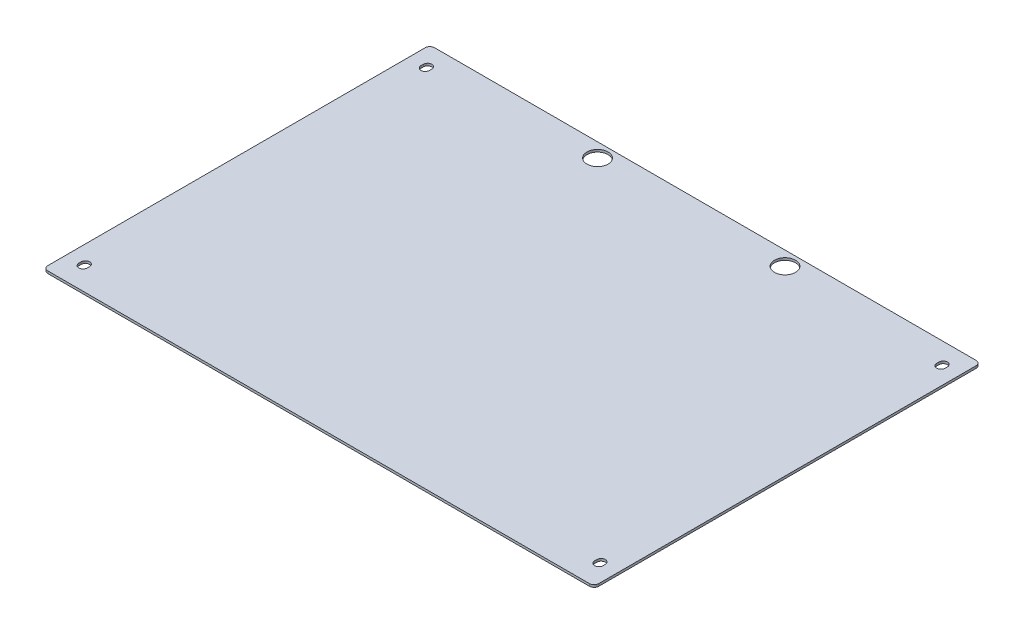
ISO-10303-21;
HEADER;
FILE_DESCRIPTION(('STEP AP214'),'2;1');
FILE_NAME('part.step','',(''),(''),'','','');
FILE_SCHEMA(('AUTOMOTIVE_DESIGN { 1 0 10303 214 1 1 1 1 }'));
ENDSEC;
DATA;
#1=APPLICATION_CONTEXT('core data for automotive mechanical design processes');
#2=APPLICATION_PROTOCOL_DEFINITION('international standard','automotive_design',2000,#1);
#3=PRODUCT_CONTEXT('',#1,'mechanical');
#4=PRODUCT('Part','Part','',(#3));
#5=PRODUCT_RELATED_PRODUCT_CATEGORY('part','',(#4));
#6=PRODUCT_DEFINITION_FORMATION('','',#4);
#7=PRODUCT_DEFINITION_CONTEXT('part definition',#1,'design');
#8=PRODUCT_DEFINITION('design','',#6,#7);
#9=PRODUCT_DEFINITION_SHAPE('','',#8);
#10=(LENGTH_UNIT() NAMED_UNIT(*) SI_UNIT(.MILLI.,.METRE.));
#11=(NAMED_UNIT(*) PLANE_ANGLE_UNIT() SI_UNIT($,.RADIAN.));
#12=(NAMED_UNIT(*) SI_UNIT($,.STERADIAN.) SOLID_ANGLE_UNIT());
#13=UNCERTAINTY_MEASURE_WITH_UNIT(LENGTH_MEASURE(1.E-05),#10,'distance_accuracy_value','');
#14=(GEOMETRIC_REPRESENTATION_CONTEXT(3) GLOBAL_UNCERTAINTY_ASSIGNED_CONTEXT((#13)) GLOBAL_UNIT_ASSIGNED_CONTEXT((#10,
#11,#12)) REPRESENTATION_CONTEXT('',''));
#15=CARTESIAN_POINT('',(0.,0.,0.));
#16=DIRECTION('',(0.,0.,1.));
#17=DIRECTION('',(1.,0.,0.));
#18=AXIS2_PLACEMENT_3D('',#15,#16,#17);
#19=CARTESIAN_POINT('',(0.,-1.,0.));
#20=DIRECTION('',(0.,-1.,0.));
#21=DIRECTION('',(0.,0.,-1.));
#22=AXIS2_PLACEMENT_3D('',#19,#20,#21);
#23=PLANE('',#22);
#24=CARTESIAN_POINT('',(40.0000000000037,-1.,-76.5000000000022));
#25=DIRECTION('',(0.,-1.,0.));
#26=DIRECTION('',(0.,0.,-1.));
#27=AXIS2_PLACEMENT_3D('',#24,#25,#26);
#28=CIRCLE('',#27,4.5);
#29=CARTESIAN_POINT('',(40.0000000000037,-1.,-81.0000000000022));
#30=VERTEX_POINT('',#29);
#31=EDGE_CURVE('E403',#30,#30,#28,.T.);
#32=ORIENTED_EDGE('',*,*,#31,.F.);
#33=EDGE_LOOP('',(#32));
#34=FACE_BOUND('',#33,.T.);
#35=CARTESIAN_POINT('',(-40.0000000000037,-1.,-76.5000000000022));
#36=DIRECTION('',(0.,-1.,0.));
#37=DIRECTION('',(0.,0.,1.));
#38=AXIS2_PLACEMENT_3D('',#35,#36,#37);
#39=CIRCLE('',#38,4.5);
#40=CARTESIAN_POINT('',(-40.0000000000037,-1.,-72.0000000000022));
#41=VERTEX_POINT('',#40);
#42=EDGE_CURVE('E292',#41,#41,#39,.T.);
#43=ORIENTED_EDGE('',*,*,#42,.F.);
#44=EDGE_LOOP('',(#43));
#45=FACE_BOUND('',#44,.T.);
#46=DIRECTION('',(-1.,0.,0.));
#47=VECTOR('',#46,1.);
#48=CARTESIAN_POINT('',(-102.,-1.,-82.5));
#49=LINE('',#48,#47);
#50=CARTESIAN_POINT('',(115.534291735289,-1.0000000000001,-82.5));
#51=VERTEX_POINT('',#50);
#52=CARTESIAN_POINT('',(-115.534291735289,-1.0000000000001,-82.5));
#53=VERTEX_POINT('',#52);
#54=EDGE_CURVE('E97',#51,#53,#49,.T.);
#55=ORIENTED_EDGE('',*,*,#54,.F.);
#56=CARTESIAN_POINT('',(115.534291735289,-1.0000000000001,-80.5));
#57=DIRECTION('',(0.,1.,0.));
#58=DIRECTION('',(-1.,0.,0.));
#59=AXIS2_PLACEMENT_3D('',#56,#57,#58);
#60=CIRCLE('',#59,2.);
#61=CARTESIAN_POINT('',(117.534291735289,-1.0000000000001,-80.5));
#62=VERTEX_POINT('',#61);
#63=EDGE_CURVE('E309',#51,#62,#60,.F.);
#64=ORIENTED_EDGE('',*,*,#63,.T.);
#65=DIRECTION('',(0.,0.,1.));
#66=VECTOR('',#65,1.);
#67=CARTESIAN_POINT('',(117.534291735289,-1.0000000000001,0.));
#68=LINE('',#67,#66);
#69=CARTESIAN_POINT('',(117.534291735289,-1.0000000000001,80.5));
#70=VERTEX_POINT('',#69);
#71=EDGE_CURVE('E306',#62,#70,#68,.T.);
#72=ORIENTED_EDGE('',*,*,#71,.T.);
#73=CARTESIAN_POINT('',(115.534291735289,-1.0000000000001,80.5));
#74=DIRECTION('',(0.,1.,0.));
#75=DIRECTION('',(-1.,0.,0.));
#76=AXIS2_PLACEMENT_3D('',#73,#74,#75);
#77=CIRCLE('',#76,2.);
#78=CARTESIAN_POINT('',(115.534291735289,-1.0000000000001,82.5));
#79=VERTEX_POINT('',#78);
#80=EDGE_CURVE('E302',#70,#79,#77,.F.);
#81=ORIENTED_EDGE('',*,*,#80,.T.);
#82=DIRECTION('',(1.,0.,0.));
#83=VECTOR('',#82,1.);
#84=CARTESIAN_POINT('',(-102.,-1.,82.5));
#85=LINE('',#84,#83);
#86=CARTESIAN_POINT('',(-115.534291735289,-1.0000000000001,82.5));
#87=VERTEX_POINT('',#86);
#88=EDGE_CURVE('E13',#87,#79,#85,.T.);
#89=ORIENTED_EDGE('',*,*,#88,.F.);
#90=CARTESIAN_POINT('',(-115.534291735289,-1.0000000000001,80.5));
#91=DIRECTION('',(0.,1.,0.));
#92=DIRECTION('',(-1.,0.,0.));
#93=AXIS2_PLACEMENT_3D('',#90,#91,#92);
#94=CIRCLE('',#93,2.);
#95=CARTESIAN_POINT('',(-117.534291735289,-1.0000000000001,80.5));
#96=VERTEX_POINT('',#95);
#97=EDGE_CURVE('E471',#87,#96,#94,.F.);
#98=ORIENTED_EDGE('',*,*,#97,.T.);
#99=DIRECTION('',(0.,0.,-1.));
#100=VECTOR('',#99,1.);
#101=CARTESIAN_POINT('',(-117.534291735289,-1.0000000000001,0.));
#102=LINE('',#101,#100);
#103=CARTESIAN_POINT('',(-117.534291735289,-1.0000000000001,-80.5));
#104=VERTEX_POINT('',#103);
#105=EDGE_CURVE('E277',#96,#104,#102,.T.);
#106=ORIENTED_EDGE('',*,*,#105,.T.);
#107=CARTESIAN_POINT('',(-115.534291735289,-1.0000000000001,-80.5));
#108=DIRECTION('',(0.,1.,0.));
#109=DIRECTION('',(-1.,0.,0.));
#110=AXIS2_PLACEMENT_3D('',#107,#108,#109);
#111=CIRCLE('',#110,2.);
#112=EDGE_CURVE('E475',#104,#53,#111,.F.);
#113=ORIENTED_EDGE('',*,*,#112,.T.);
#114=EDGE_LOOP('',(#55,#64,#72,#81,#89,#98,#106,#113));
#115=FACE_BOUND('',#114,.T.);
#116=DIRECTION('',(0.,0.,-1.));
#117=VECTOR('',#116,1.);
#118=CARTESIAN_POINT('',(108.234291735288,-1.00000000000004,73.));
#119=LINE('',#118,#117);
#120=CARTESIAN_POINT('',(108.234291735288,-1.00000000000004,73.));
#121=VERTEX_POINT('',#120);
#122=CARTESIAN_POINT('',(108.234291735288,-1.00000000000004,72.));
#123=VERTEX_POINT('',#122);
#124=EDGE_CURVE('E312',#121,#123,#119,.T.);
#125=ORIENTED_EDGE('',*,*,#124,.F.);
#126=CARTESIAN_POINT('',(110.034291735289,-1.00000000000004,73.));
#127=DIRECTION('',(0.,-1.,0.));
#128=DIRECTION('',(1.,0.,0.));
#129=AXIS2_PLACEMENT_3D('',#126,#127,#128);
#130=CIRCLE('',#129,1.80000000000004);
#131=CARTESIAN_POINT('',(111.834291735289,-1.00000000000007,73.));
#132=VERTEX_POINT('',#131);
#133=EDGE_CURVE('E323',#132,#121,#130,.T.);
#134=ORIENTED_EDGE('',*,*,#133,.F.);
#135=DIRECTION('',(0.,0.,1.));
#136=VECTOR('',#135,1.);
#137=CARTESIAN_POINT('',(111.834291735289,-1.00000000000007,73.));
#138=LINE('',#137,#136);
#139=CARTESIAN_POINT('',(111.834291735289,-1.00000000000007,72.));
#140=VERTEX_POINT('',#139);
#141=EDGE_CURVE('E332',#140,#132,#138,.T.);
#142=ORIENTED_EDGE('',*,*,#141,.F.);
#143=CARTESIAN_POINT('',(110.034291735289,-1.00000000000004,72.));
#144=DIRECTION('',(0.,-1.,0.));
#145=DIRECTION('',(1.,0.,0.));
#146=AXIS2_PLACEMENT_3D('',#143,#144,#145);
#147=CIRCLE('',#146,1.80000000000004);
#148=EDGE_CURVE('E342',#123,#140,#147,.T.);
#149=ORIENTED_EDGE('',*,*,#148,.F.);
#150=EDGE_LOOP('',(#125,#134,#142,#149));
#151=FACE_BOUND('',#150,.T.);
#152=DIRECTION('',(0.,0.,-1.));
#153=VECTOR('',#152,1.);
#154=CARTESIAN_POINT('',(108.234291735288,-1.00000000000004,-73.));
#155=LINE('',#154,#153);
#156=CARTESIAN_POINT('',(108.234291735288,-1.00000000000004,-73.));
#157=VERTEX_POINT('',#156);
#158=CARTESIAN_POINT('',(108.234291735288,-1.00000000000004,-74.));
#159=VERTEX_POINT('',#158);
#160=EDGE_CURVE('E353',#157,#159,#155,.T.);
#161=ORIENTED_EDGE('',*,*,#160,.F.);
#162=CARTESIAN_POINT('',(110.034291735289,-1.00000000000004,-73.));
#163=DIRECTION('',(0.,-1.,0.));
#164=DIRECTION('',(1.,0.,0.));
#165=AXIS2_PLACEMENT_3D('',#162,#163,#164);
#166=CIRCLE('',#165,1.80000000000004);
#167=CARTESIAN_POINT('',(111.834291735289,-1.00000000000007,-73.));
#168=VERTEX_POINT('',#167);
#169=EDGE_CURVE('E364',#168,#157,#166,.T.);
#170=ORIENTED_EDGE('',*,*,#169,.F.);
#171=DIRECTION('',(0.,0.,1.));
#172=VECTOR('',#171,1.);
#173=CARTESIAN_POINT('',(111.834291735289,-1.00000000000007,-73.));
#174=LINE('',#173,#172);
#175=CARTESIAN_POINT('',(111.834291735289,-1.00000000000007,-74.));
#176=VERTEX_POINT('',#175);
#177=EDGE_CURVE('E373',#176,#168,#174,.T.);
#178=ORIENTED_EDGE('',*,*,#177,.F.);
#179=CARTESIAN_POINT('',(110.034291735289,-1.00000000000004,-74.));
#180=DIRECTION('',(0.,-1.,0.));
#181=DIRECTION('',(1.,0.,0.));
#182=AXIS2_PLACEMENT_3D('',#179,#180,#181);
#183=CIRCLE('',#182,1.80000000000002);
#184=EDGE_CURVE('E383',#159,#176,#183,.T.);
#185=ORIENTED_EDGE('',*,*,#184,.F.);
#186=EDGE_LOOP('',(#161,#170,#178,#185));
#187=FACE_BOUND('',#186,.T.);
#188=DIRECTION('',(0.,0.,1.));
#189=VECTOR('',#188,1.);
#190=CARTESIAN_POINT('',(-111.834291735289,-1.0000000000001,73.));
#191=LINE('',#190,#189);
#192=CARTESIAN_POINT('',(-111.834291735289,-1.0000000000001,72.));
#193=VERTEX_POINT('',#192);
#194=CARTESIAN_POINT('',(-111.834291735289,-1.0000000000001,73.));
#195=VERTEX_POINT('',#194);
#196=EDGE_CURVE('E512',#193,#195,#191,.T.);
#197=ORIENTED_EDGE('',*,*,#196,.T.);
#198=CARTESIAN_POINT('',(-110.034291735289,-1.0000000000001,73.));
#199=DIRECTION('',(0.,1.,0.));
#200=DIRECTION('',(-1.,0.,0.));
#201=AXIS2_PLACEMENT_3D('',#198,#199,#200);
#202=CIRCLE('',#201,1.80000000000004);
#203=CARTESIAN_POINT('',(-108.234291735289,-1.0000000000001,73.));
#204=VERTEX_POINT('',#203);
#205=EDGE_CURVE('E508',#195,#204,#202,.T.);
#206=ORIENTED_EDGE('',*,*,#205,.T.);
#207=DIRECTION('',(0.,0.,-1.));
#208=VECTOR('',#207,1.);
#209=CARTESIAN_POINT('',(-108.234291735289,-1.0000000000001,73.));
#210=LINE('',#209,#208);
#211=CARTESIAN_POINT('',(-108.234291735289,-1.00000000000004,72.));
#212=VERTEX_POINT('',#211);
#213=EDGE_CURVE('E504',#204,#212,#210,.T.);
#214=ORIENTED_EDGE('',*,*,#213,.T.);
#215=CARTESIAN_POINT('',(-110.034291735289,-1.0000000000001,72.));
#216=DIRECTION('',(0.,1.,0.));
#217=DIRECTION('',(-1.,0.,0.));
#218=AXIS2_PLACEMENT_3D('',#215,#216,#217);
#219=CIRCLE('',#218,1.80000000000004);
#220=EDGE_CURVE('E500',#212,#193,#219,.T.);
#221=ORIENTED_EDGE('',*,*,#220,.T.);
#222=EDGE_LOOP('',(#197,#206,#214,#221));
#223=FACE_BOUND('',#222,.T.);
#224=DIRECTION('',(0.,0.,1.));
#225=VECTOR('',#224,1.);
#226=CARTESIAN_POINT('',(-111.834291735289,-1.0000000000001,-73.));
#227=LINE('',#226,#225);
#228=CARTESIAN_POINT('',(-111.834291735289,-1.0000000000001,-74.));
#229=VERTEX_POINT('',#228);
#230=CARTESIAN_POINT('',(-111.834291735289,-1.0000000000001,-73.));
#231=VERTEX_POINT('',#230);
#232=EDGE_CURVE('E496',#229,#231,#227,.T.);
#233=ORIENTED_EDGE('',*,*,#232,.T.);
#234=CARTESIAN_POINT('',(-110.034291735289,-1.0000000000001,-73.));
#235=DIRECTION('',(0.,1.,0.));
#236=DIRECTION('',(-1.,0.,0.));
#237=AXIS2_PLACEMENT_3D('',#234,#235,#236);
#238=CIRCLE('',#237,1.80000000000004);
#239=CARTESIAN_POINT('',(-108.234291735289,-1.0000000000001,-73.));
#240=VERTEX_POINT('',#239);
#241=EDGE_CURVE('E492',#231,#240,#238,.T.);
#242=ORIENTED_EDGE('',*,*,#241,.T.);
#243=DIRECTION('',(0.,0.,-1.));
#244=VECTOR('',#243,1.);
#245=CARTESIAN_POINT('',(-108.234291735289,-1.0000000000001,-73.));
#246=LINE('',#245,#244);
#247=CARTESIAN_POINT('',(-108.234291735289,-1.00000000000004,-74.));
#248=VERTEX_POINT('',#247);
#249=EDGE_CURVE('E488',#240,#248,#246,.T.);
#250=ORIENTED_EDGE('',*,*,#249,.T.);
#251=CARTESIAN_POINT('',(-110.034291735289,-1.0000000000001,-74.));
#252=DIRECTION('',(0.,1.,0.));
#253=DIRECTION('',(-1.,0.,0.));
#254=AXIS2_PLACEMENT_3D('',#251,#252,#253);
#255=CIRCLE('',#254,1.80000000000002);
#256=EDGE_CURVE('E484',#248,#229,#255,.T.);
#257=ORIENTED_EDGE('',*,*,#256,.T.);
#258=EDGE_LOOP('',(#233,#242,#250,#257));
#259=FACE_BOUND('',#258,.T.);
#260=ADVANCED_FACE('F86',(#34,#45,#115,#151,#187,#223,#259),#23,.T.);
#261=CARTESIAN_POINT('',(0.,0.,0.));
#262=DIRECTION('',(0.,-1.,0.));
#263=DIRECTION('',(0.,0.,-1.));
#264=AXIS2_PLACEMENT_3D('',#261,#262,#263);
#265=PLANE('',#264);
#266=CARTESIAN_POINT('',(40.0000000000037,0.,-76.5000000000022));
#267=DIRECTION('',(0.,-1.,0.));
#268=DIRECTION('',(0.,0.,-1.));
#269=AXIS2_PLACEMENT_3D('',#266,#267,#268);
#270=CIRCLE('',#269,4.5);
#271=CARTESIAN_POINT('',(40.0000000000037,0.,-81.0000000000022));
#272=VERTEX_POINT('',#271);
#273=EDGE_CURVE('E90',#272,#272,#270,.T.);
#274=ORIENTED_EDGE('',*,*,#273,.T.);
#275=EDGE_LOOP('',(#274));
#276=FACE_BOUND('',#275,.T.);
#277=CARTESIAN_POINT('',(-40.0000000000037,0.,-76.5000000000022));
#278=DIRECTION('',(0.,-1.,0.));
#279=DIRECTION('',(0.,0.,-1.));
#280=AXIS2_PLACEMENT_3D('',#277,#278,#279);
#281=CIRCLE('',#280,4.5);
#282=CARTESIAN_POINT('',(-40.0000000000037,0.,-81.0000000000022));
#283=VERTEX_POINT('',#282);
#284=EDGE_CURVE('E407',#283,#283,#281,.T.);
#285=ORIENTED_EDGE('',*,*,#284,.T.);
#286=EDGE_LOOP('',(#285));
#287=FACE_BOUND('',#286,.T.);
#288=DIRECTION('',(1.,0.,0.));
#289=VECTOR('',#288,1.);
#290=CARTESIAN_POINT('',(-102.,0.,82.5));
#291=LINE('',#290,#289);
#292=CARTESIAN_POINT('',(-115.534291735289,0.,82.5));
#293=VERTEX_POINT('',#292);
#294=CARTESIAN_POINT('',(115.534291735289,0.,82.5));
#295=VERTEX_POINT('',#294);
#296=EDGE_CURVE('E182',#293,#295,#291,.T.);
#297=ORIENTED_EDGE('',*,*,#296,.T.);
#298=CARTESIAN_POINT('',(115.534291735289,0.,80.5));
#299=DIRECTION('',(0.,1.,0.));
#300=DIRECTION('',(-1.,0.,0.));
#301=AXIS2_PLACEMENT_3D('',#298,#299,#300);
#302=CIRCLE('',#301,2.);
#303=CARTESIAN_POINT('',(117.534291735289,0.,80.5));
#304=VERTEX_POINT('',#303);
#305=EDGE_CURVE('E106',#295,#304,#302,.T.);
#306=ORIENTED_EDGE('',*,*,#305,.T.);
#307=DIRECTION('',(0.,0.,-1.));
#308=VECTOR('',#307,1.);
#309=CARTESIAN_POINT('',(117.534291735289,0.,82.5));
#310=LINE('',#309,#308);
#311=CARTESIAN_POINT('',(117.534291735289,0.,-80.5));
#312=VERTEX_POINT('',#311);
#313=EDGE_CURVE('E396',#312,#304,#310,.F.);
#314=ORIENTED_EDGE('',*,*,#313,.F.);
#315=CARTESIAN_POINT('',(115.534291735289,0.,-80.5));
#316=DIRECTION('',(0.,1.,0.));
#317=DIRECTION('',(-1.,0.,0.));
#318=AXIS2_PLACEMENT_3D('',#315,#316,#317);
#319=CIRCLE('',#318,2.);
#320=CARTESIAN_POINT('',(115.534291735289,0.,-82.5));
#321=VERTEX_POINT('',#320);
#322=EDGE_CURVE('E295',#312,#321,#319,.T.);
#323=ORIENTED_EDGE('',*,*,#322,.T.);
#324=DIRECTION('',(-1.,0.,0.));
#325=VECTOR('',#324,1.);
#326=CARTESIAN_POINT('',(-102.,0.,-82.5));
#327=LINE('',#326,#325);
#328=CARTESIAN_POINT('',(-115.534291735289,0.,-82.5));
#329=VERTEX_POINT('',#328);
#330=EDGE_CURVE('E253',#321,#329,#327,.T.);
#331=ORIENTED_EDGE('',*,*,#330,.T.);
#332=CARTESIAN_POINT('',(-115.534291735289,0.,-80.5));
#333=DIRECTION('',(0.,1.,0.));
#334=DIRECTION('',(-1.,0.,0.));
#335=AXIS2_PLACEMENT_3D('',#332,#333,#334);
#336=CIRCLE('',#335,2.);
#337=CARTESIAN_POINT('',(-117.534291735289,0.,-80.5));
#338=VERTEX_POINT('',#337);
#339=EDGE_CURVE('E268',#329,#338,#336,.T.);
#340=ORIENTED_EDGE('',*,*,#339,.T.);
#341=DIRECTION('',(0.,0.,1.));
#342=VECTOR('',#341,1.);
#343=CARTESIAN_POINT('',(-117.534291735289,0.,-82.5));
#344=LINE('',#343,#342);
#345=CARTESIAN_POINT('',(-117.534291735289,0.,80.5));
#346=VERTEX_POINT('',#345);
#347=EDGE_CURVE('E274',#346,#338,#344,.F.);
#348=ORIENTED_EDGE('',*,*,#347,.F.);
#349=CARTESIAN_POINT('',(-115.534291735289,0.,80.5));
#350=DIRECTION('',(0.,1.,0.));
#351=DIRECTION('',(-1.,0.,0.));
#352=AXIS2_PLACEMENT_3D('',#349,#350,#351);
#353=CIRCLE('',#352,2.);
#354=EDGE_CURVE('E259',#346,#293,#353,.T.);
#355=ORIENTED_EDGE('',*,*,#354,.T.);
#356=EDGE_LOOP('',(#297,#306,#314,#323,#331,#340,#348,#355));
#357=FACE_BOUND('',#356,.T.);
#358=CARTESIAN_POINT('',(110.034291735289,0.,73.));
#359=DIRECTION('',(0.,1.,0.));
#360=DIRECTION('',(-1.,0.,0.));
#361=AXIS2_PLACEMENT_3D('',#358,#359,#360);
#362=CIRCLE('',#361,1.80000000000004);
#363=CARTESIAN_POINT('',(108.234291735288,0.,73.));
#364=VERTEX_POINT('',#363);
#365=CARTESIAN_POINT('',(111.834291735289,0.,73.));
#366=VERTEX_POINT('',#365);
#367=EDGE_CURVE('E329',#364,#366,#362,.T.);
#368=ORIENTED_EDGE('',*,*,#367,.F.);
#369=DIRECTION('',(0.,0.,1.));
#370=VECTOR('',#369,1.);
#371=CARTESIAN_POINT('',(108.234291735288,0.,0.));
#372=LINE('',#371,#370);
#373=CARTESIAN_POINT('',(108.234291735288,0.,72.));
#374=VERTEX_POINT('',#373);
#375=EDGE_CURVE('E320',#374,#364,#372,.T.);
#376=ORIENTED_EDGE('',*,*,#375,.F.);
#377=CARTESIAN_POINT('',(110.034291735289,0.,72.));
#378=DIRECTION('',(0.,1.,0.));
#379=DIRECTION('',(-1.,0.,0.));
#380=AXIS2_PLACEMENT_3D('',#377,#378,#379);
#381=CIRCLE('',#380,1.80000000000004);
#382=CARTESIAN_POINT('',(111.834291735289,0.,72.));
#383=VERTEX_POINT('',#382);
#384=EDGE_CURVE('E349',#383,#374,#381,.T.);
#385=ORIENTED_EDGE('',*,*,#384,.F.);
#386=DIRECTION('',(0.,0.,-1.));
#387=VECTOR('',#386,1.);
#388=CARTESIAN_POINT('',(111.834291735289,0.,0.));
#389=LINE('',#388,#387);
#390=EDGE_CURVE('E339',#366,#383,#389,.T.);
#391=ORIENTED_EDGE('',*,*,#390,.F.);
#392=EDGE_LOOP('',(#368,#376,#385,#391));
#393=FACE_BOUND('',#392,.T.);
#394=CARTESIAN_POINT('',(110.034291735289,0.,-73.));
#395=DIRECTION('',(0.,1.,0.));
#396=DIRECTION('',(-1.,0.,0.));
#397=AXIS2_PLACEMENT_3D('',#394,#395,#396);
#398=CIRCLE('',#397,1.80000000000004);
#399=CARTESIAN_POINT('',(108.234291735288,0.,-73.));
#400=VERTEX_POINT('',#399);
#401=CARTESIAN_POINT('',(111.834291735289,0.,-73.));
#402=VERTEX_POINT('',#401);
#403=EDGE_CURVE('E370',#400,#402,#398,.T.);
#404=ORIENTED_EDGE('',*,*,#403,.F.);
#405=DIRECTION('',(0.,0.,1.));
#406=VECTOR('',#405,1.);
#407=CARTESIAN_POINT('',(108.234291735287,0.,1.33573707650197E-13));
#408=LINE('',#407,#406);
#409=CARTESIAN_POINT('',(108.234291735288,0.,-74.));
#410=VERTEX_POINT('',#409);
#411=EDGE_CURVE('E361',#410,#400,#408,.T.);
#412=ORIENTED_EDGE('',*,*,#411,.F.);
#413=CARTESIAN_POINT('',(110.034291735289,0.,-74.));
#414=DIRECTION('',(0.,1.,0.));
#415=DIRECTION('',(-1.,0.,0.));
#416=AXIS2_PLACEMENT_3D('',#413,#414,#415);
#417=CIRCLE('',#416,1.80000000000002);
#418=CARTESIAN_POINT('',(111.834291735289,0.,-74.));
#419=VERTEX_POINT('',#418);
#420=EDGE_CURVE('E390',#419,#410,#417,.T.);
#421=ORIENTED_EDGE('',*,*,#420,.F.);
#422=DIRECTION('',(0.,0.,-1.));
#423=VECTOR('',#422,1.);
#424=CARTESIAN_POINT('',(111.83429173529,0.,-1.96023752785407E-13));
#425=LINE('',#424,#423);
#426=EDGE_CURVE('E380',#402,#419,#425,.T.);
#427=ORIENTED_EDGE('',*,*,#426,.F.);
#428=EDGE_LOOP('',(#404,#412,#421,#427));
#429=FACE_BOUND('',#428,.T.);
#430=CARTESIAN_POINT('',(-110.034291735289,0.,73.));
#431=DIRECTION('',(0.,1.,0.));
#432=DIRECTION('',(-1.,0.,0.));
#433=AXIS2_PLACEMENT_3D('',#430,#431,#432);
#434=CIRCLE('',#433,1.80000000000004);
#435=CARTESIAN_POINT('',(-111.834291735289,0.,73.));
#436=VERTEX_POINT('',#435);
#437=CARTESIAN_POINT('',(-108.234291735289,0.,73.));
#438=VERTEX_POINT('',#437);
#439=EDGE_CURVE('E527',#436,#438,#434,.T.);
#440=ORIENTED_EDGE('',*,*,#439,.F.);
#441=DIRECTION('',(0.,0.,1.));
#442=VECTOR('',#441,1.);
#443=CARTESIAN_POINT('',(-111.834291735289,0.,0.));
#444=LINE('',#443,#442);
#445=CARTESIAN_POINT('',(-111.834291735289,0.,72.));
#446=VERTEX_POINT('',#445);
#447=EDGE_CURVE('E520',#446,#436,#444,.T.);
#448=ORIENTED_EDGE('',*,*,#447,.F.);
#449=CARTESIAN_POINT('',(-110.034291735289,0.,72.));
#450=DIRECTION('',(0.,1.,0.));
#451=DIRECTION('',(-1.,0.,0.));
#452=AXIS2_PLACEMENT_3D('',#449,#450,#451);
#453=CIRCLE('',#452,1.80000000000004);
#454=CARTESIAN_POINT('',(-108.234291735289,0.,72.));
#455=VERTEX_POINT('',#454);
#456=EDGE_CURVE('E541',#455,#446,#453,.T.);
#457=ORIENTED_EDGE('',*,*,#456,.F.);
#458=DIRECTION('',(0.,0.,-1.));
#459=VECTOR('',#458,1.);
#460=CARTESIAN_POINT('',(-108.234291735289,0.,0.));
#461=LINE('',#460,#459);
#462=EDGE_CURVE('E534',#438,#455,#461,.T.);
#463=ORIENTED_EDGE('',*,*,#462,.F.);
#464=EDGE_LOOP('',(#440,#448,#457,#463));
#465=FACE_BOUND('',#464,.T.);
#466=CARTESIAN_POINT('',(-110.034291735289,0.,-73.));
#467=DIRECTION('',(0.,1.,0.));
#468=DIRECTION('',(-1.,0.,0.));
#469=AXIS2_PLACEMENT_3D('',#466,#467,#468);
#470=CIRCLE('',#469,1.80000000000004);
#471=CARTESIAN_POINT('',(-111.834291735289,0.,-73.));
#472=VERTEX_POINT('',#471);
#473=CARTESIAN_POINT('',(-108.234291735289,0.,-73.));
#474=VERTEX_POINT('',#473);
#475=EDGE_CURVE('E555',#472,#474,#470,.T.);
#476=ORIENTED_EDGE('',*,*,#475,.F.);
#477=DIRECTION('',(0.,0.,1.));
#478=VECTOR('',#477,1.);
#479=CARTESIAN_POINT('',(-111.834291735291,0.,-1.96023752785419E-13));
#480=LINE('',#479,#478);
#481=CARTESIAN_POINT('',(-111.834291735289,0.,-74.));
#482=VERTEX_POINT('',#481);
#483=EDGE_CURVE('E548',#482,#472,#480,.T.);
#484=ORIENTED_EDGE('',*,*,#483,.F.);
#485=CARTESIAN_POINT('',(-110.034291735289,0.,-74.));
#486=DIRECTION('',(0.,1.,0.));
#487=DIRECTION('',(-1.,0.,0.));
#488=AXIS2_PLACEMENT_3D('',#485,#486,#487);
#489=CIRCLE('',#488,1.80000000000002);
#490=CARTESIAN_POINT('',(-108.234291735289,0.,-74.));
#491=VERTEX_POINT('',#490);
#492=EDGE_CURVE('E279',#491,#482,#489,.T.);
#493=ORIENTED_EDGE('',*,*,#492,.F.);
#494=DIRECTION('',(0.,0.,-1.));
#495=VECTOR('',#494,1.);
#496=CARTESIAN_POINT('',(-108.234291735288,0.,1.33573707650209E-13));
#497=LINE('',#496,#495);
#498=EDGE_CURVE('E562',#474,#491,#497,.T.);
#499=ORIENTED_EDGE('',*,*,#498,.F.);
#500=EDGE_LOOP('',(#476,#484,#493,#499));
#501=FACE_BOUND('',#500,.T.);
#502=ADVANCED_FACE('F88',(#276,#287,#357,#393,#429,#465,#501),#265,.F.);
#503=CARTESIAN_POINT('',(-102.,-1.,-82.5));
#504=DIRECTION('',(0.,0.,-1.));
#505=DIRECTION('',(-1.,0.,0.));
#506=AXIS2_PLACEMENT_3D('',#503,#504,#505);
#507=PLANE('',#506);
#508=ORIENTED_EDGE('',*,*,#330,.F.);
#509=DIRECTION('',(0.,1.,0.));
#510=VECTOR('',#509,1.);
#511=CARTESIAN_POINT('',(115.534291735289,-1.00000000000008,-82.5));
#512=LINE('',#511,#510);
#513=EDGE_CURVE('E298',#321,#51,#512,.F.);
#514=ORIENTED_EDGE('',*,*,#513,.T.);
#515=ORIENTED_EDGE('',*,*,#54,.T.);
#516=DIRECTION('',(0.,1.,0.));
#517=VECTOR('',#516,1.);
#518=CARTESIAN_POINT('',(-115.534291735289,-1.0000000000001,-82.5));
#519=LINE('',#518,#517);
#520=EDGE_CURVE('E267',#53,#329,#519,.T.);
#521=ORIENTED_EDGE('',*,*,#520,.T.);
#522=EDGE_LOOP('',(#508,#514,#515,#521));
#523=FACE_BOUND('',#522,.T.);
#524=ADVANCED_FACE('F450',(#523),#507,.T.);
#525=CARTESIAN_POINT('',(-102.,-1.,82.5));
#526=DIRECTION('',(0.,0.,1.));
#527=DIRECTION('',(1.,0.,0.));
#528=AXIS2_PLACEMENT_3D('',#525,#526,#527);
#529=PLANE('',#528);
#530=ORIENTED_EDGE('',*,*,#88,.T.);
#531=DIRECTION('',(0.,1.,0.));
#532=VECTOR('',#531,1.);
#533=CARTESIAN_POINT('',(115.534291735289,-1.0000000000001,82.5));
#534=LINE('',#533,#532);
#535=EDGE_CURVE('E289',#79,#295,#534,.T.);
#536=ORIENTED_EDGE('',*,*,#535,.T.);
#537=ORIENTED_EDGE('',*,*,#296,.F.);
#538=DIRECTION('',(0.,1.,0.));
#539=VECTOR('',#538,1.);
#540=CARTESIAN_POINT('',(-115.534291735289,-1.00000000000008,82.5));
#541=LINE('',#540,#539);
#542=EDGE_CURVE('E264',#293,#87,#541,.F.);
#543=ORIENTED_EDGE('',*,*,#542,.T.);
#544=EDGE_LOOP('',(#530,#536,#537,#543));
#545=FACE_BOUND('',#544,.T.);
#546=ADVANCED_FACE('F440',(#545),#529,.T.);
#547=CARTESIAN_POINT('',(-40.0000000000037,9.,-76.5000000000022));
#548=DIRECTION('',(0.,-1.,0.));
#549=DIRECTION('',(0.,0.,-1.));
#550=AXIS2_PLACEMENT_3D('',#547,#548,#549);
#551=CYLINDRICAL_SURFACE('',#550,4.5);
#552=ORIENTED_EDGE('',*,*,#42,.T.);
#553=EDGE_LOOP('',(#552));
#554=FACE_BOUND('',#553,.T.);
#555=ORIENTED_EDGE('',*,*,#284,.F.);
#556=EDGE_LOOP('',(#555));
#557=FACE_BOUND('',#556,.T.);
#558=ADVANCED_FACE('F430',(#554,#557),#551,.F.);
#559=CARTESIAN_POINT('',(40.0000000000037,9.,-76.5000000000022));
#560=DIRECTION('',(0.,-1.,0.));
#561=DIRECTION('',(0.,0.,-1.));
#562=AXIS2_PLACEMENT_3D('',#559,#560,#561);
#563=CYLINDRICAL_SURFACE('',#562,4.5);
#564=ORIENTED_EDGE('',*,*,#31,.T.);
#565=EDGE_LOOP('',(#564));
#566=FACE_BOUND('',#565,.T.);
#567=ORIENTED_EDGE('',*,*,#273,.F.);
#568=EDGE_LOOP('',(#567));
#569=FACE_BOUND('',#568,.T.);
#570=ADVANCED_FACE('F427',(#566,#569),#563,.F.);
#571=CARTESIAN_POINT('',(115.534291735289,-1.0000000000001,80.5));
#572=DIRECTION('',(0.,1.,0.));
#573=DIRECTION('',(-1.,0.,0.));
#574=AXIS2_PLACEMENT_3D('',#571,#572,#573);
#575=CYLINDRICAL_SURFACE('',#574,2.);
#576=ORIENTED_EDGE('',*,*,#80,.F.);
#577=DIRECTION('',(0.,1.,0.));
#578=VECTOR('',#577,1.);
#579=CARTESIAN_POINT('',(117.534291735289,-1.0000000000001,80.5));
#580=LINE('',#579,#578);
#581=EDGE_CURVE('E177',#304,#70,#580,.F.);
#582=ORIENTED_EDGE('',*,*,#581,.F.);
#583=ORIENTED_EDGE('',*,*,#305,.F.);
#584=ORIENTED_EDGE('',*,*,#535,.F.);
#585=EDGE_LOOP('',(#576,#582,#583,#584));
#586=FACE_BOUND('',#585,.T.);
#587=ADVANCED_FACE('F429',(#586),#575,.T.);
#588=CARTESIAN_POINT('',(117.534291735289,-1.0000000000001,82.5));
#589=DIRECTION('',(-1.,0.,0.));
#590=DIRECTION('',(0.,-1.,0.));
#591=AXIS2_PLACEMENT_3D('',#588,#589,#590);
#592=PLANE('',#591);
#593=ORIENTED_EDGE('',*,*,#71,.F.);
#594=DIRECTION('',(0.,1.,0.));
#595=VECTOR('',#594,1.);
#596=CARTESIAN_POINT('',(117.534291735289,-1.0000000000001,-80.5));
#597=LINE('',#596,#595);
#598=EDGE_CURVE('E399',#62,#312,#597,.T.);
#599=ORIENTED_EDGE('',*,*,#598,.T.);
#600=ORIENTED_EDGE('',*,*,#313,.T.);
#601=ORIENTED_EDGE('',*,*,#581,.T.);
#602=EDGE_LOOP('',(#593,#599,#600,#601));
#603=FACE_BOUND('',#602,.T.);
#604=ADVANCED_FACE('F437',(#603),#592,.F.);
#605=CARTESIAN_POINT('',(115.534291735289,-1.00000000000008,-80.5));
#606=DIRECTION('',(0.,1.,0.));
#607=DIRECTION('',(-1.,0.,0.));
#608=AXIS2_PLACEMENT_3D('',#605,#606,#607);
#609=CYLINDRICAL_SURFACE('',#608,2.);
#610=ORIENTED_EDGE('',*,*,#63,.F.);
#611=ORIENTED_EDGE('',*,*,#513,.F.);
#612=ORIENTED_EDGE('',*,*,#322,.F.);
#613=ORIENTED_EDGE('',*,*,#598,.F.);
#614=EDGE_LOOP('',(#610,#611,#612,#613));
#615=FACE_BOUND('',#614,.T.);
#616=ADVANCED_FACE('F465',(#615),#609,.T.);
#617=CARTESIAN_POINT('',(110.03429173529,203.,-74.));
#618=DIRECTION('',(0.,-1.,0.));
#619=DIRECTION('',(1.,0.,0.));
#620=AXIS2_PLACEMENT_3D('',#617,#618,#619);
#621=CYLINDRICAL_SURFACE('',#620,1.80000000000002);
#622=ORIENTED_EDGE('',*,*,#420,.T.);
#623=DIRECTION('',(0.,-1.,0.));
#624=VECTOR('',#623,1.);
#625=CARTESIAN_POINT('',(108.23429173529,203.,-74.));
#626=LINE('',#625,#624);
#627=EDGE_CURVE('E387',#410,#159,#626,.T.);
#628=ORIENTED_EDGE('',*,*,#627,.T.);
#629=ORIENTED_EDGE('',*,*,#184,.T.);
#630=DIRECTION('',(0.,-1.,0.));
#631=VECTOR('',#630,1.);
#632=CARTESIAN_POINT('',(111.83429173529,203.,-74.));
#633=LINE('',#632,#631);
#634=EDGE_CURVE('E377',#419,#176,#633,.T.);
#635=ORIENTED_EDGE('',*,*,#634,.F.);
#636=EDGE_LOOP('',(#622,#628,#629,#635));
#637=FACE_BOUND('',#636,.T.);
#638=ADVANCED_FACE('F621',(#637),#621,.F.);
#639=CARTESIAN_POINT('',(111.83429173529,203.,-73.));
#640=DIRECTION('',(1.,0.,0.));
#641=DIRECTION('',(0.,0.,1.));
#642=AXIS2_PLACEMENT_3D('',#639,#640,#641);
#643=PLANE('',#642);
#644=ORIENTED_EDGE('',*,*,#426,.T.);
#645=ORIENTED_EDGE('',*,*,#634,.T.);
#646=ORIENTED_EDGE('',*,*,#177,.T.);
#647=DIRECTION('',(0.,-1.,0.));
#648=VECTOR('',#647,1.);
#649=CARTESIAN_POINT('',(111.83429173529,203.,-73.));
#650=LINE('',#649,#648);
#651=EDGE_CURVE('E367',#402,#168,#650,.T.);
#652=ORIENTED_EDGE('',*,*,#651,.F.);
#653=EDGE_LOOP('',(#644,#645,#646,#652));
#654=FACE_BOUND('',#653,.T.);
#655=ADVANCED_FACE('F624',(#654),#643,.F.);
#656=CARTESIAN_POINT('',(110.03429173529,203.,-73.));
#657=DIRECTION('',(0.,-1.,0.));
#658=DIRECTION('',(1.,0.,0.));
#659=AXIS2_PLACEMENT_3D('',#656,#657,#658);
#660=CYLINDRICAL_SURFACE('',#659,1.80000000000004);
#661=ORIENTED_EDGE('',*,*,#403,.T.);
#662=ORIENTED_EDGE('',*,*,#651,.T.);
#663=ORIENTED_EDGE('',*,*,#169,.T.);
#664=DIRECTION('',(0.,-1.,0.));
#665=VECTOR('',#664,1.);
#666=CARTESIAN_POINT('',(108.23429173529,203.,-73.));
#667=LINE('',#666,#665);
#668=EDGE_CURVE('E357',#400,#157,#667,.T.);
#669=ORIENTED_EDGE('',*,*,#668,.F.);
#670=EDGE_LOOP('',(#661,#662,#663,#669));
#671=FACE_BOUND('',#670,.T.);
#672=ADVANCED_FACE('F628',(#671),#660,.F.);
#673=CARTESIAN_POINT('',(108.23429173529,203.,-73.));
#674=DIRECTION('',(-1.,0.,0.));
#675=DIRECTION('',(0.,0.,-1.));
#676=AXIS2_PLACEMENT_3D('',#673,#674,#675);
#677=PLANE('',#676);
#678=ORIENTED_EDGE('',*,*,#411,.T.);
#679=ORIENTED_EDGE('',*,*,#668,.T.);
#680=ORIENTED_EDGE('',*,*,#160,.T.);
#681=ORIENTED_EDGE('',*,*,#627,.F.);
#682=EDGE_LOOP('',(#678,#679,#680,#681));
#683=FACE_BOUND('',#682,.T.);
#684=ADVANCED_FACE('F632',(#683),#677,.F.);
#685=CARTESIAN_POINT('',(110.03429173529,203.,72.));
#686=DIRECTION('',(0.,-1.,0.));
#687=DIRECTION('',(1.,0.,0.));
#688=AXIS2_PLACEMENT_3D('',#685,#686,#687);
#689=CYLINDRICAL_SURFACE('',#688,1.80000000000004);
#690=ORIENTED_EDGE('',*,*,#384,.T.);
#691=DIRECTION('',(0.,-1.,0.));
#692=VECTOR('',#691,1.);
#693=CARTESIAN_POINT('',(108.23429173529,203.,72.));
#694=LINE('',#693,#692);
#695=EDGE_CURVE('E346',#374,#123,#694,.T.);
#696=ORIENTED_EDGE('',*,*,#695,.T.);
#697=ORIENTED_EDGE('',*,*,#148,.T.);
#698=DIRECTION('',(0.,-1.,0.));
#699=VECTOR('',#698,1.);
#700=CARTESIAN_POINT('',(111.83429173529,203.,72.));
#701=LINE('',#700,#699);
#702=EDGE_CURVE('E336',#383,#140,#701,.T.);
#703=ORIENTED_EDGE('',*,*,#702,.F.);
#704=EDGE_LOOP('',(#690,#696,#697,#703));
#705=FACE_BOUND('',#704,.T.);
#706=ADVANCED_FACE('F636',(#705),#689,.F.);
#707=CARTESIAN_POINT('',(111.83429173529,203.,73.));
#708=DIRECTION('',(1.,0.,0.));
#709=DIRECTION('',(0.,1.,0.));
#710=AXIS2_PLACEMENT_3D('',#707,#708,#709);
#711=PLANE('',#710);
#712=ORIENTED_EDGE('',*,*,#390,.T.);
#713=ORIENTED_EDGE('',*,*,#702,.T.);
#714=ORIENTED_EDGE('',*,*,#141,.T.);
#715=DIRECTION('',(0.,-1.,0.));
#716=VECTOR('',#715,1.);
#717=CARTESIAN_POINT('',(111.83429173529,203.,73.));
#718=LINE('',#717,#716);
#719=EDGE_CURVE('E326',#366,#132,#718,.T.);
#720=ORIENTED_EDGE('',*,*,#719,.F.);
#721=EDGE_LOOP('',(#712,#713,#714,#720));
#722=FACE_BOUND('',#721,.T.);
#723=ADVANCED_FACE('F640',(#722),#711,.F.);
#724=CARTESIAN_POINT('',(110.03429173529,203.,73.));
#725=DIRECTION('',(0.,-1.,0.));
#726=DIRECTION('',(1.,0.,0.));
#727=AXIS2_PLACEMENT_3D('',#724,#725,#726);
#728=CYLINDRICAL_SURFACE('',#727,1.80000000000004);
#729=ORIENTED_EDGE('',*,*,#367,.T.);
#730=ORIENTED_EDGE('',*,*,#719,.T.);
#731=ORIENTED_EDGE('',*,*,#133,.T.);
#732=DIRECTION('',(0.,-1.,0.));
#733=VECTOR('',#732,1.);
#734=CARTESIAN_POINT('',(108.23429173529,203.,73.));
#735=LINE('',#734,#733);
#736=EDGE_CURVE('E316',#364,#121,#735,.T.);
#737=ORIENTED_EDGE('',*,*,#736,.F.);
#738=EDGE_LOOP('',(#729,#730,#731,#737));
#739=FACE_BOUND('',#738,.T.);
#740=ADVANCED_FACE('F644',(#739),#728,.F.);
#741=CARTESIAN_POINT('',(108.23429173529,203.,73.));
#742=DIRECTION('',(-1.,0.,0.));
#743=DIRECTION('',(0.,-1.,0.));
#744=AXIS2_PLACEMENT_3D('',#741,#742,#743);
#745=PLANE('',#744);
#746=ORIENTED_EDGE('',*,*,#375,.T.);
#747=ORIENTED_EDGE('',*,*,#736,.T.);
#748=ORIENTED_EDGE('',*,*,#124,.T.);
#749=ORIENTED_EDGE('',*,*,#695,.F.);
#750=EDGE_LOOP('',(#746,#747,#748,#749));
#751=FACE_BOUND('',#750,.T.);
#752=ADVANCED_FACE('F647',(#751),#745,.F.);
#753=CARTESIAN_POINT('',(-115.534291735289,-1.00000000000008,80.5));
#754=DIRECTION('',(0.,1.,0.));
#755=DIRECTION('',(-1.,0.,0.));
#756=AXIS2_PLACEMENT_3D('',#753,#754,#755);
#757=CYLINDRICAL_SURFACE('',#756,2.);
#758=ORIENTED_EDGE('',*,*,#97,.F.);
#759=ORIENTED_EDGE('',*,*,#542,.F.);
#760=ORIENTED_EDGE('',*,*,#354,.F.);
#761=DIRECTION('',(0.,1.,0.));
#762=VECTOR('',#761,1.);
#763=CARTESIAN_POINT('',(-117.534291735289,-1.0000000000001,80.5));
#764=LINE('',#763,#762);
#765=EDGE_CURVE('E263',#96,#346,#764,.T.);
#766=ORIENTED_EDGE('',*,*,#765,.F.);
#767=EDGE_LOOP('',(#758,#759,#760,#766));
#768=FACE_BOUND('',#767,.T.);
#769=ADVANCED_FACE('F262',(#768),#757,.T.);
#770=CARTESIAN_POINT('',(-115.534291735289,-1.0000000000001,-80.5));
#771=DIRECTION('',(0.,1.,0.));
#772=DIRECTION('',(-1.,0.,0.));
#773=AXIS2_PLACEMENT_3D('',#770,#771,#772);
#774=CYLINDRICAL_SURFACE('',#773,2.);
#775=ORIENTED_EDGE('',*,*,#112,.F.);
#776=DIRECTION('',(0.,1.,0.));
#777=VECTOR('',#776,1.);
#778=CARTESIAN_POINT('',(-117.534291735289,-1.0000000000001,-80.5));
#779=LINE('',#778,#777);
#780=EDGE_CURVE('E280',#338,#104,#779,.F.);
#781=ORIENTED_EDGE('',*,*,#780,.F.);
#782=ORIENTED_EDGE('',*,*,#339,.F.);
#783=ORIENTED_EDGE('',*,*,#520,.F.);
#784=EDGE_LOOP('',(#775,#781,#782,#783));
#785=FACE_BOUND('',#784,.T.);
#786=ADVANCED_FACE('F654',(#785),#774,.T.);
#787=CARTESIAN_POINT('',(-117.534291735289,-1.0000000000001,-82.5));
#788=DIRECTION('',(1.,0.,0.));
#789=DIRECTION('',(0.,1.,0.));
#790=AXIS2_PLACEMENT_3D('',#787,#788,#789);
#791=PLANE('',#790);
#792=ORIENTED_EDGE('',*,*,#347,.T.);
#793=ORIENTED_EDGE('',*,*,#780,.T.);
#794=ORIENTED_EDGE('',*,*,#105,.F.);
#795=ORIENTED_EDGE('',*,*,#765,.T.);
#796=EDGE_LOOP('',(#792,#793,#794,#795));
#797=FACE_BOUND('',#796,.T.);
#798=ADVANCED_FACE('F273',(#797),#791,.F.);
#799=CARTESIAN_POINT('',(-110.034291735289,-1.0000000000001,-74.));
#800=DIRECTION('',(0.,1.,0.));
#801=DIRECTION('',(-1.,0.,0.));
#802=AXIS2_PLACEMENT_3D('',#799,#800,#801);
#803=CYLINDRICAL_SURFACE('',#802,1.80000000000002);
#804=ORIENTED_EDGE('',*,*,#492,.T.);
#805=DIRECTION('',(0.,1.,0.));
#806=VECTOR('',#805,1.);
#807=CARTESIAN_POINT('',(-111.834291735289,-1.0000000000001,-74.));
#808=LINE('',#807,#806);
#809=EDGE_CURVE('E544',#229,#482,#808,.T.);
#810=ORIENTED_EDGE('',*,*,#809,.F.);
#811=ORIENTED_EDGE('',*,*,#256,.F.);
#812=DIRECTION('',(0.,1.,0.));
#813=VECTOR('',#812,1.);
#814=CARTESIAN_POINT('',(-108.234291735289,-1.0000000000001,-74.));
#815=LINE('',#814,#813);
#816=EDGE_CURVE('E565',#248,#491,#815,.T.);
#817=ORIENTED_EDGE('',*,*,#816,.T.);
#818=EDGE_LOOP('',(#804,#810,#811,#817));
#819=FACE_BOUND('',#818,.T.);
#820=ADVANCED_FACE('F573',(#819),#803,.F.);
#821=CARTESIAN_POINT('',(-108.234291735289,-1.0000000000001,-73.));
#822=DIRECTION('',(1.,0.,0.));
#823=DIRECTION('',(0.,0.,-1.));
#824=AXIS2_PLACEMENT_3D('',#821,#822,#823);
#825=PLANE('',#824);
#826=ORIENTED_EDGE('',*,*,#498,.T.);
#827=ORIENTED_EDGE('',*,*,#816,.F.);
#828=ORIENTED_EDGE('',*,*,#249,.F.);
#829=DIRECTION('',(0.,1.,0.));
#830=VECTOR('',#829,1.);
#831=CARTESIAN_POINT('',(-108.234291735289,-1.0000000000001,-73.));
#832=LINE('',#831,#830);
#833=EDGE_CURVE('E559',#240,#474,#832,.T.);
#834=ORIENTED_EDGE('',*,*,#833,.T.);
#835=EDGE_LOOP('',(#826,#827,#828,#834));
#836=FACE_BOUND('',#835,.T.);
#837=ADVANCED_FACE('F588',(#836),#825,.F.);
#838=CARTESIAN_POINT('',(-110.034291735289,-1.0000000000001,-73.));
#839=DIRECTION('',(0.,1.,0.));
#840=DIRECTION('',(-1.,0.,0.));
#841=AXIS2_PLACEMENT_3D('',#838,#839,#840);
#842=CYLINDRICAL_SURFACE('',#841,1.80000000000004);
#843=ORIENTED_EDGE('',*,*,#475,.T.);
#844=ORIENTED_EDGE('',*,*,#833,.F.);
#845=ORIENTED_EDGE('',*,*,#241,.F.);
#846=DIRECTION('',(0.,1.,0.));
#847=VECTOR('',#846,1.);
#848=CARTESIAN_POINT('',(-111.834291735289,-1.0000000000001,-73.));
#849=LINE('',#848,#847);
#850=EDGE_CURVE('E551',#231,#472,#849,.T.);
#851=ORIENTED_EDGE('',*,*,#850,.T.);
#852=EDGE_LOOP('',(#843,#844,#845,#851));
#853=FACE_BOUND('',#852,.T.);
#854=ADVANCED_FACE('F583',(#853),#842,.F.);
#855=CARTESIAN_POINT('',(-111.834291735289,-1.0000000000001,-73.));
#856=DIRECTION('',(-1.,0.,0.));
#857=DIRECTION('',(0.,0.,1.));
#858=AXIS2_PLACEMENT_3D('',#855,#856,#857);
#859=PLANE('',#858);
#860=ORIENTED_EDGE('',*,*,#483,.T.);
#861=ORIENTED_EDGE('',*,*,#850,.F.);
#862=ORIENTED_EDGE('',*,*,#232,.F.);
#863=ORIENTED_EDGE('',*,*,#809,.T.);
#864=EDGE_LOOP('',(#860,#861,#862,#863));
#865=FACE_BOUND('',#864,.T.);
#866=ADVANCED_FACE('F580',(#865),#859,.F.);
#867=CARTESIAN_POINT('',(-110.034291735289,-1.0000000000001,72.));
#868=DIRECTION('',(0.,1.,0.));
#869=DIRECTION('',(-1.,0.,0.));
#870=AXIS2_PLACEMENT_3D('',#867,#868,#869);
#871=CYLINDRICAL_SURFACE('',#870,1.80000000000004);
#872=ORIENTED_EDGE('',*,*,#456,.T.);
#873=DIRECTION('',(0.,1.,0.));
#874=VECTOR('',#873,1.);
#875=CARTESIAN_POINT('',(-111.834291735289,-1.0000000000001,72.));
#876=LINE('',#875,#874);
#877=EDGE_CURVE('E516',#193,#446,#876,.T.);
#878=ORIENTED_EDGE('',*,*,#877,.F.);
#879=ORIENTED_EDGE('',*,*,#220,.F.);
#880=DIRECTION('',(0.,1.,0.));
#881=VECTOR('',#880,1.);
#882=CARTESIAN_POINT('',(-108.234291735289,-1.0000000000001,72.));
#883=LINE('',#882,#881);
#884=EDGE_CURVE('E537',#212,#455,#883,.T.);
#885=ORIENTED_EDGE('',*,*,#884,.T.);
#886=EDGE_LOOP('',(#872,#878,#879,#885));
#887=FACE_BOUND('',#886,.T.);
#888=ADVANCED_FACE('F601',(#887),#871,.F.);
#889=CARTESIAN_POINT('',(-108.234291735289,-1.0000000000001,73.));
#890=DIRECTION('',(1.,0.,0.));
#891=DIRECTION('',(0.,1.,0.));
#892=AXIS2_PLACEMENT_3D('',#889,#890,#891);
#893=PLANE('',#892);
#894=ORIENTED_EDGE('',*,*,#462,.T.);
#895=ORIENTED_EDGE('',*,*,#884,.F.);
#896=ORIENTED_EDGE('',*,*,#213,.F.);
#897=DIRECTION('',(0.,1.,0.));
#898=VECTOR('',#897,1.);
#899=CARTESIAN_POINT('',(-108.234291735289,-1.0000000000001,73.));
#900=LINE('',#899,#898);
#901=EDGE_CURVE('E531',#204,#438,#900,.T.);
#902=ORIENTED_EDGE('',*,*,#901,.T.);
#903=EDGE_LOOP('',(#894,#895,#896,#902));
#904=FACE_BOUND('',#903,.T.);
#905=ADVANCED_FACE('F604',(#904),#893,.F.);
#906=CARTESIAN_POINT('',(-110.034291735289,-1.0000000000001,73.));
#907=DIRECTION('',(0.,1.,0.));
#908=DIRECTION('',(-1.,0.,0.));
#909=AXIS2_PLACEMENT_3D('',#906,#907,#908);
#910=CYLINDRICAL_SURFACE('',#909,1.80000000000004);
#911=ORIENTED_EDGE('',*,*,#439,.T.);
#912=ORIENTED_EDGE('',*,*,#901,.F.);
#913=ORIENTED_EDGE('',*,*,#205,.F.);
#914=DIRECTION('',(0.,1.,0.));
#915=VECTOR('',#914,1.);
#916=CARTESIAN_POINT('',(-111.834291735289,-1.0000000000001,73.));
#917=LINE('',#916,#915);
#918=EDGE_CURVE('E523',#195,#436,#917,.T.);
#919=ORIENTED_EDGE('',*,*,#918,.T.);
#920=EDGE_LOOP('',(#911,#912,#913,#919));
#921=FACE_BOUND('',#920,.T.);
#922=ADVANCED_FACE('F608',(#921),#910,.F.);
#923=CARTESIAN_POINT('',(-111.834291735289,-1.0000000000001,73.));
#924=DIRECTION('',(-1.,0.,0.));
#925=DIRECTION('',(0.,-1.,0.));
#926=AXIS2_PLACEMENT_3D('',#923,#924,#925);
#927=PLANE('',#926);
#928=ORIENTED_EDGE('',*,*,#447,.T.);
#929=ORIENTED_EDGE('',*,*,#918,.F.);
#930=ORIENTED_EDGE('',*,*,#196,.F.);
#931=ORIENTED_EDGE('',*,*,#877,.T.);
#932=EDGE_LOOP('',(#928,#929,#930,#931));
#933=FACE_BOUND('',#932,.T.);
#934=ADVANCED_FACE('F612',(#933),#927,.F.);
#935=CLOSED_SHELL('',(#260,#502,#524,#546,#558,#570,#587,#604,#616,#638,#655,#672,#684,#706,
#723,#740,#752,#769,#786,#798,#820,#837,#854,#866,#888,#905,#922,#934));
#936=MANIFOLD_SOLID_BREP('B2',#935);
#937=ADVANCED_BREP_SHAPE_REPRESENTATION('',(#18,#936),#14);
#938=SHAPE_DEFINITION_REPRESENTATION(#9,#937);
ENDSEC;
END-ISO-10303-21;
